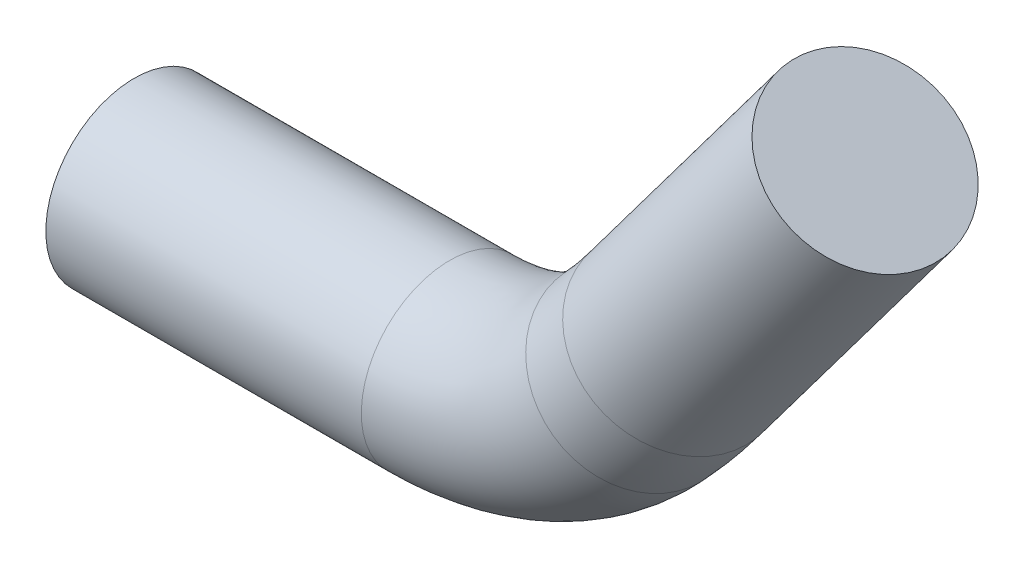
ISO-10303-21;
HEADER;
FILE_DESCRIPTION(('STEP AP214'),'2;1');
FILE_NAME('part.step','',(''),(''),'','','');
FILE_SCHEMA(('AUTOMOTIVE_DESIGN { 1 0 10303 214 1 1 1 1 }'));
ENDSEC;
DATA;
#1=APPLICATION_CONTEXT('core data for automotive mechanical design processes');
#2=APPLICATION_PROTOCOL_DEFINITION('international standard','automotive_design',2000,#1);
#3=PRODUCT_CONTEXT('',#1,'mechanical');
#4=PRODUCT('Part','Part','',(#3));
#5=PRODUCT_RELATED_PRODUCT_CATEGORY('part','',(#4));
#6=PRODUCT_DEFINITION_FORMATION('','',#4);
#7=PRODUCT_DEFINITION_CONTEXT('part definition',#1,'design');
#8=PRODUCT_DEFINITION('design','',#6,#7);
#9=PRODUCT_DEFINITION_SHAPE('','',#8);
#10=(LENGTH_UNIT() NAMED_UNIT(*) SI_UNIT(.MILLI.,.METRE.));
#11=(NAMED_UNIT(*) PLANE_ANGLE_UNIT() SI_UNIT($,.RADIAN.));
#12=(NAMED_UNIT(*) SI_UNIT($,.STERADIAN.) SOLID_ANGLE_UNIT());
#13=UNCERTAINTY_MEASURE_WITH_UNIT(LENGTH_MEASURE(1.E-05),#10,'distance_accuracy_value','');
#14=(GEOMETRIC_REPRESENTATION_CONTEXT(3) GLOBAL_UNCERTAINTY_ASSIGNED_CONTEXT((#13)) GLOBAL_UNIT_ASSIGNED_CONTEXT((#10,
#11,#12)) REPRESENTATION_CONTEXT('',''));
#15=CARTESIAN_POINT('',(0.,0.,0.));
#16=DIRECTION('',(0.,0.,1.));
#17=DIRECTION('',(1.,0.,0.));
#18=AXIS2_PLACEMENT_3D('',#15,#16,#17);
#19=CARTESIAN_POINT('',(0.,0.,0.));
#20=DIRECTION('',(1.,0.,0.));
#21=DIRECTION('',(0.,0.,-1.));
#22=AXIS2_PLACEMENT_3D('',#19,#20,#21);
#23=PLANE('',#22);
#24=CARTESIAN_POINT('',(0.,0.,0.));
#25=DIRECTION('',(1.,0.,0.));
#26=DIRECTION('',(0.,0.,-1.));
#27=AXIS2_PLACEMENT_3D('',#24,#25,#26);
#28=CIRCLE('',#27,3.556);
#29=CARTESIAN_POINT('',(0.,0.,-3.556));
#30=VERTEX_POINT('',#29);
#31=EDGE_CURVE('E53',#30,#30,#28,.T.);
#32=ORIENTED_EDGE('',*,*,#31,.F.);
#33=EDGE_LOOP('',(#32));
#34=FACE_BOUND('',#33,.T.);
#35=ADVANCED_FACE('F34',(#34),#23,.F.);
#36=CARTESIAN_POINT('',(29.4232962329142,15.3971292810278,0.));
#37=DIRECTION('',(0.6,0.8,0.));
#38=DIRECTION('',(0.,0.,-1.));
#39=AXIS2_PLACEMENT_3D('',#36,#37,#38);
#40=PLANE('',#39);
#41=CARTESIAN_POINT('',(29.4232962329142,15.3971292810278,0.));
#42=DIRECTION('',(0.6,0.8,0.));
#43=DIRECTION('',(0.,0.,-1.));
#44=AXIS2_PLACEMENT_3D('',#41,#42,#43);
#45=CIRCLE('',#44,3.556);
#46=CARTESIAN_POINT('',(29.4232962329142,15.3971292810278,-3.556));
#47=VERTEX_POINT('',#46);
#48=EDGE_CURVE('E10',#47,#47,#45,.T.);
#49=ORIENTED_EDGE('',*,*,#48,.T.);
#50=EDGE_LOOP('',(#49));
#51=FACE_BOUND('',#50,.T.);
#52=ADVANCED_FACE('F60',(#51),#40,.T.);
#53=CARTESIAN_POINT('',(0.,0.,0.));
#54=DIRECTION('',(1.,0.,0.));
#55=DIRECTION('',(0.,0.,-1.));
#56=AXIS2_PLACEMENT_3D('',#53,#54,#55);
#57=CYLINDRICAL_SURFACE('',#56,3.556);
#58=CARTESIAN_POINT('',(12.7,0.,0.));
#59=DIRECTION('',(1.,0.,0.));
#60=DIRECTION('',(0.,0.,-1.));
#61=AXIS2_PLACEMENT_3D('',#58,#59,#60);
#62=CIRCLE('',#61,3.556);
#63=CARTESIAN_POINT('',(12.7,-3.556,0.));
#64=VERTEX_POINT('',#63);
#65=EDGE_CURVE('E48',#64,#64,#62,.T.);
#66=ORIENTED_EDGE('',*,*,#65,.F.);
#67=EDGE_LOOP('',(#66));
#68=FACE_BOUND('',#67,.T.);
#69=ORIENTED_EDGE('',*,*,#31,.T.);
#70=EDGE_LOOP('',(#69));
#71=FACE_BOUND('',#70,.T.);
#72=ADVANCED_FACE('F57',(#68,#71),#57,.T.);
#73=CARTESIAN_POINT('',(12.7,10.16,0.));
#74=DIRECTION('',(0.,0.,1.));
#75=DIRECTION('',(1.,0.,0.));
#76=AXIS2_PLACEMENT_3D('',#73,#74,#75);
#77=TOROIDAL_SURFACE('',#76,10.16,3.556);
#78=CARTESIAN_POINT('',(20.1778025113906,3.28191381264811,0.));
#79=DIRECTION('',(0.676976986944084,0.736004184191985,0.));
#80=DIRECTION('',(0.,0.,-1.));
#81=AXIS2_PLACEMENT_3D('',#78,#79,#80);
#82=CIRCLE('',#81,3.556);
#83=CARTESIAN_POINT('',(22.7950333903773,0.87458364707494,0.));
#84=VERTEX_POINT('',#83);
#85=EDGE_CURVE('E44',#84,#84,#82,.T.);
#86=CARTESIAN_POINT('',(12.7,10.16,0.));
#87=DIRECTION('',(0.,0.,1.));
#88=DIRECTION('',(1.,0.,0.));
#89=AXIS2_PLACEMENT_3D('',#86,#87,#88);
#90=CIRCLE('',#89,13.716);
#91=EDGE_CURVE('',#64,#84,#90,.T.);
#92=ORIENTED_EDGE('',*,*,#65,.T.);
#93=ORIENTED_EDGE('',*,*,#85,.F.);
#94=ORIENTED_EDGE('',*,*,#91,.T.);
#95=ORIENTED_EDGE('',*,*,#91,.F.);
#96=EDGE_LOOP('',(#92,#94,#93,#95));
#97=FACE_BOUND('',#96,.T.);
#98=ADVANCED_FACE('F72',(#97),#77,.T.);
#99=CARTESIAN_POINT('',(1.48329623291415,20.4771292810278,0.));
#100=DIRECTION('',(0.,0.,1.));
#101=DIRECTION('',(1.,0.,0.));
#102=AXIS2_PLACEMENT_3D('',#99,#100,#101);
#103=TOROIDAL_SURFACE('',#102,25.4,3.556);
#104=CARTESIAN_POINT('',(21.8032962329141,5.23712928102784,0.));
#105=DIRECTION('',(0.6,0.8,0.));
#106=DIRECTION('',(0.,0.,-1.));
#107=AXIS2_PLACEMENT_3D('',#104,#105,#106);
#108=CIRCLE('',#107,3.556);
#109=CARTESIAN_POINT('',(24.6480962329142,3.10352928102784,0.));
#110=VERTEX_POINT('',#109);
#111=EDGE_CURVE('E40',#110,#110,#108,.T.);
#112=CARTESIAN_POINT('',(1.48329623291415,20.4771292810278,0.));
#113=DIRECTION('',(0.,0.,1.));
#114=DIRECTION('',(1.,0.,0.));
#115=AXIS2_PLACEMENT_3D('',#112,#113,#114);
#116=CIRCLE('',#115,28.956);
#117=EDGE_CURVE('',#84,#110,#116,.T.);
#118=ORIENTED_EDGE('',*,*,#85,.T.);
#119=ORIENTED_EDGE('',*,*,#111,.F.);
#120=ORIENTED_EDGE('',*,*,#117,.T.);
#121=ORIENTED_EDGE('',*,*,#117,.F.);
#122=EDGE_LOOP('',(#118,#120,#119,#121));
#123=FACE_BOUND('',#122,.T.);
#124=ADVANCED_FACE('F66',(#123),#103,.T.);
#125=CARTESIAN_POINT('',(21.8032962329142,5.23712928102784,0.));
#126=DIRECTION('',(0.6,0.8,0.));
#127=DIRECTION('',(-0.8,0.6,0.));
#128=AXIS2_PLACEMENT_3D('',#125,#126,#127);
#129=CYLINDRICAL_SURFACE('',#128,3.556);
#130=ORIENTED_EDGE('',*,*,#48,.F.);
#131=EDGE_LOOP('',(#130));
#132=FACE_BOUND('',#131,.T.);
#133=ORIENTED_EDGE('',*,*,#111,.T.);
#134=EDGE_LOOP('',(#133));
#135=FACE_BOUND('',#134,.T.);
#136=ADVANCED_FACE('F64',(#132,#135),#129,.T.);
#137=CLOSED_SHELL('',(#35,#52,#72,#98,#124,#136));
#138=MANIFOLD_SOLID_BREP('B2',#137);
#139=ADVANCED_BREP_SHAPE_REPRESENTATION('',(#18,#138),#14);
#140=SHAPE_DEFINITION_REPRESENTATION(#9,#139);
ENDSEC;
END-ISO-10303-21;
